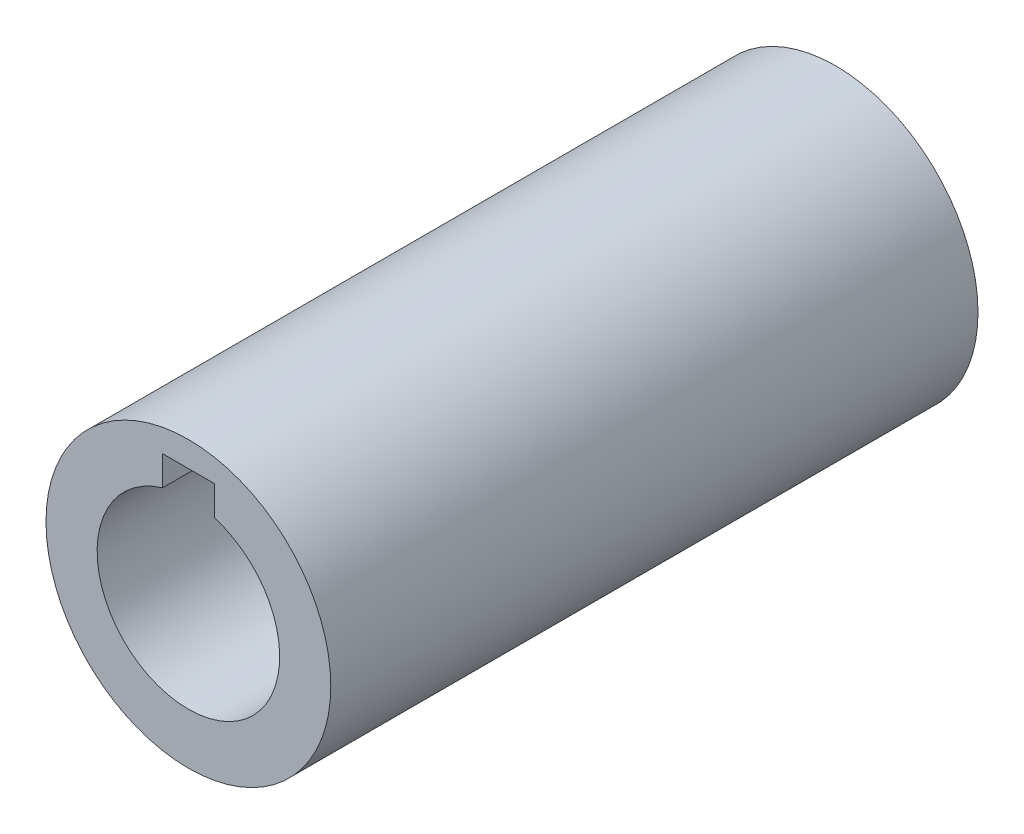
ISO-10303-21;
HEADER;
FILE_DESCRIPTION(('STEP AP214'),'2;1');
FILE_NAME('part.step','',(''),(''),'','','');
FILE_SCHEMA(('AUTOMOTIVE_DESIGN { 1 0 10303 214 1 1 1 1 }'));
ENDSEC;
DATA;
#1=APPLICATION_CONTEXT('core data for automotive mechanical design processes');
#2=APPLICATION_PROTOCOL_DEFINITION('international standard','automotive_design',2000,#1);
#3=PRODUCT_CONTEXT('',#1,'mechanical');
#4=PRODUCT('Part','Part','',(#3));
#5=PRODUCT_RELATED_PRODUCT_CATEGORY('part','',(#4));
#6=PRODUCT_DEFINITION_FORMATION('','',#4);
#7=PRODUCT_DEFINITION_CONTEXT('part definition',#1,'design');
#8=PRODUCT_DEFINITION('design','',#6,#7);
#9=PRODUCT_DEFINITION_SHAPE('','',#8);
#10=(LENGTH_UNIT() NAMED_UNIT(*) SI_UNIT(.MILLI.,.METRE.));
#11=(NAMED_UNIT(*) PLANE_ANGLE_UNIT() SI_UNIT($,.RADIAN.));
#12=(NAMED_UNIT(*) SI_UNIT($,.STERADIAN.) SOLID_ANGLE_UNIT());
#13=UNCERTAINTY_MEASURE_WITH_UNIT(LENGTH_MEASURE(1.E-05),#10,'distance_accuracy_value','');
#14=(GEOMETRIC_REPRESENTATION_CONTEXT(3) GLOBAL_UNCERTAINTY_ASSIGNED_CONTEXT((#13)) GLOBAL_UNIT_ASSIGNED_CONTEXT((#10,
#11,#12)) REPRESENTATION_CONTEXT('',''));
#15=CARTESIAN_POINT('',(0.,0.,0.));
#16=DIRECTION('',(0.,0.,1.));
#17=DIRECTION('',(1.,0.,0.));
#18=AXIS2_PLACEMENT_3D('',#15,#16,#17);
#19=CARTESIAN_POINT('',(0.,0.,100.));
#20=DIRECTION('',(0.,0.,1.));
#21=DIRECTION('',(1.,0.,0.));
#22=AXIS2_PLACEMENT_3D('',#19,#20,#21);
#23=PLANE('',#22);
#24=DIRECTION('',(0.,1.,0.));
#25=VECTOR('',#24,1.);
#26=CARTESIAN_POINT('',(-4.,12.1,100.));
#27=LINE('',#26,#25);
#28=CARTESIAN_POINT('',(-4.,13.5207248326412,100.));
#29=VERTEX_POINT('',#28);
#30=CARTESIAN_POINT('',(-4.,18.1,100.));
#31=VERTEX_POINT('',#30);
#32=EDGE_CURVE('E82',#29,#31,#27,.T.);
#33=ORIENTED_EDGE('',*,*,#32,.T.);
#34=DIRECTION('',(-1.,0.,0.));
#35=VECTOR('',#34,1.);
#36=CARTESIAN_POINT('',(0.,18.1,100.));
#37=LINE('',#36,#35);
#38=CARTESIAN_POINT('',(4.,18.1,100.));
#39=VERTEX_POINT('',#38);
#40=EDGE_CURVE('E73',#39,#31,#37,.T.);
#41=ORIENTED_EDGE('',*,*,#40,.F.);
#42=DIRECTION('',(0.,-1.,0.));
#43=VECTOR('',#42,1.);
#44=CARTESIAN_POINT('',(4.,18.1,100.));
#45=LINE('',#44,#43);
#46=CARTESIAN_POINT('',(4.,13.5207248326412,100.));
#47=VERTEX_POINT('',#46);
#48=EDGE_CURVE('E96',#39,#47,#45,.T.);
#49=ORIENTED_EDGE('',*,*,#48,.T.);
#50=CARTESIAN_POINT('',(0.,0.,100.));
#51=DIRECTION('',(0.,0.,1.));
#52=DIRECTION('',(1.,0.,0.));
#53=AXIS2_PLACEMENT_3D('',#50,#51,#52);
#54=CIRCLE('',#53,14.1);
#55=EDGE_CURVE('E95',#29,#47,#54,.T.);
#56=ORIENTED_EDGE('',*,*,#55,.F.);
#57=EDGE_LOOP('',(#33,#41,#49,#56));
#58=FACE_BOUND('',#57,.T.);
#59=CARTESIAN_POINT('',(0.,0.,100.));
#60=DIRECTION('',(0.,0.,1.));
#61=DIRECTION('',(1.,0.,0.));
#62=AXIS2_PLACEMENT_3D('',#59,#60,#61);
#63=CIRCLE('',#62,22.);
#64=CARTESIAN_POINT('',(22.,0.,100.));
#65=VERTEX_POINT('',#64);
#66=EDGE_CURVE('E108',#65,#65,#63,.T.);
#67=ORIENTED_EDGE('',*,*,#66,.T.);
#68=EDGE_LOOP('',(#67));
#69=FACE_BOUND('',#68,.T.);
#70=ADVANCED_FACE('F35',(#58,#69),#23,.T.);
#71=CARTESIAN_POINT('',(0.,0.,0.));
#72=DIRECTION('',(0.,0.,1.));
#73=DIRECTION('',(1.,0.,0.));
#74=AXIS2_PLACEMENT_3D('',#71,#72,#73);
#75=PLANE('',#74);
#76=CARTESIAN_POINT('',(0.,0.,0.));
#77=DIRECTION('',(0.,0.,1.));
#78=DIRECTION('',(1.,0.,0.));
#79=AXIS2_PLACEMENT_3D('',#76,#77,#78);
#80=CIRCLE('',#79,22.);
#81=CARTESIAN_POINT('',(22.,0.,0.));
#82=VERTEX_POINT('',#81);
#83=EDGE_CURVE('E105',#82,#82,#80,.T.);
#84=ORIENTED_EDGE('',*,*,#83,.F.);
#85=EDGE_LOOP('',(#84));
#86=FACE_BOUND('',#85,.T.);
#87=DIRECTION('',(1.,0.,0.));
#88=VECTOR('',#87,1.);
#89=CARTESIAN_POINT('',(0.,18.1,0.));
#90=LINE('',#89,#88);
#91=CARTESIAN_POINT('',(-4.,18.1,0.));
#92=VERTEX_POINT('',#91);
#93=CARTESIAN_POINT('',(4.,18.1,0.));
#94=VERTEX_POINT('',#93);
#95=EDGE_CURVE('E83',#92,#94,#90,.T.);
#96=ORIENTED_EDGE('',*,*,#95,.F.);
#97=DIRECTION('',(0.,1.,0.));
#98=VECTOR('',#97,1.);
#99=CARTESIAN_POINT('',(-4.,12.1,0.));
#100=LINE('',#99,#98);
#101=CARTESIAN_POINT('',(-4.,13.5207248326412,0.));
#102=VERTEX_POINT('',#101);
#103=EDGE_CURVE('E89',#102,#92,#100,.T.);
#104=ORIENTED_EDGE('',*,*,#103,.F.);
#105=CARTESIAN_POINT('',(0.,0.,0.));
#106=DIRECTION('',(0.,0.,1.));
#107=DIRECTION('',(1.,0.,0.));
#108=AXIS2_PLACEMENT_3D('',#105,#106,#107);
#109=CIRCLE('',#108,14.1);
#110=CARTESIAN_POINT('',(4.,13.5207248326412,0.));
#111=VERTEX_POINT('',#110);
#112=EDGE_CURVE('E90',#102,#111,#109,.T.);
#113=ORIENTED_EDGE('',*,*,#112,.T.);
#114=DIRECTION('',(0.,-1.,0.));
#115=VECTOR('',#114,1.);
#116=CARTESIAN_POINT('',(4.,18.1,0.));
#117=LINE('',#116,#115);
#118=EDGE_CURVE('E50',#94,#111,#117,.T.);
#119=ORIENTED_EDGE('',*,*,#118,.F.);
#120=EDGE_LOOP('',(#96,#104,#113,#119));
#121=FACE_BOUND('',#120,.T.);
#122=ADVANCED_FACE('F115',(#86,#121),#75,.F.);
#123=CARTESIAN_POINT('',(0.,0.,100.));
#124=DIRECTION('',(0.,0.,-1.));
#125=DIRECTION('',(-1.,0.,0.));
#126=AXIS2_PLACEMENT_3D('',#123,#124,#125);
#127=CYLINDRICAL_SURFACE('',#126,22.);
#128=ORIENTED_EDGE('',*,*,#66,.F.);
#129=EDGE_LOOP('',(#128));
#130=FACE_BOUND('',#129,.T.);
#131=ORIENTED_EDGE('',*,*,#83,.T.);
#132=EDGE_LOOP('',(#131));
#133=FACE_BOUND('',#132,.T.);
#134=ADVANCED_FACE('F37',(#130,#133),#127,.T.);
#135=CARTESIAN_POINT('',(0.,0.,100.));
#136=DIRECTION('',(0.,0.,-1.));
#137=DIRECTION('',(-1.,0.,0.));
#138=AXIS2_PLACEMENT_3D('',#135,#136,#137);
#139=CYLINDRICAL_SURFACE('',#138,14.1);
#140=DIRECTION('',(0.,0.,-1.));
#141=VECTOR('',#140,1.);
#142=CARTESIAN_POINT('',(-4.,13.5207248326412,100.));
#143=LINE('',#142,#141);
#144=EDGE_CURVE('E11',#29,#102,#143,.T.);
#145=ORIENTED_EDGE('',*,*,#144,.F.);
#146=ORIENTED_EDGE('',*,*,#55,.T.);
#147=DIRECTION('',(0.,0.,-1.));
#148=VECTOR('',#147,1.);
#149=CARTESIAN_POINT('',(4.,13.5207248326412,100.));
#150=LINE('',#149,#148);
#151=EDGE_CURVE('E43',#111,#47,#150,.F.);
#152=ORIENTED_EDGE('',*,*,#151,.F.);
#153=ORIENTED_EDGE('',*,*,#112,.F.);
#154=EDGE_LOOP('',(#145,#146,#152,#153));
#155=FACE_BOUND('',#154,.T.);
#156=ADVANCED_FACE('F120',(#155),#139,.F.);
#157=CARTESIAN_POINT('',(-4.,12.1,100.));
#158=DIRECTION('',(-1.,0.,0.));
#159=DIRECTION('',(0.,0.,1.));
#160=AXIS2_PLACEMENT_3D('',#157,#158,#159);
#161=PLANE('',#160);
#162=ORIENTED_EDGE('',*,*,#144,.T.);
#163=ORIENTED_EDGE('',*,*,#103,.T.);
#164=DIRECTION('',(0.,0.,-1.));
#165=VECTOR('',#164,1.);
#166=CARTESIAN_POINT('',(-4.,18.1,100.));
#167=LINE('',#166,#165);
#168=EDGE_CURVE('E77',#31,#92,#167,.T.);
#169=ORIENTED_EDGE('',*,*,#168,.F.);
#170=ORIENTED_EDGE('',*,*,#32,.F.);
#171=EDGE_LOOP('',(#162,#163,#169,#170));
#172=FACE_BOUND('',#171,.T.);
#173=ADVANCED_FACE('F86',(#172),#161,.F.);
#174=CARTESIAN_POINT('',(4.,18.1,100.));
#175=DIRECTION('',(1.,0.,0.));
#176=DIRECTION('',(0.,1.,0.));
#177=AXIS2_PLACEMENT_3D('',#174,#175,#176);
#178=PLANE('',#177);
#179=ORIENTED_EDGE('',*,*,#151,.T.);
#180=ORIENTED_EDGE('',*,*,#48,.F.);
#181=DIRECTION('',(0.,0.,-1.));
#182=VECTOR('',#181,1.);
#183=CARTESIAN_POINT('',(4.,18.1,100.));
#184=LINE('',#183,#182);
#185=EDGE_CURVE('E79',#39,#94,#184,.T.);
#186=ORIENTED_EDGE('',*,*,#185,.T.);
#187=ORIENTED_EDGE('',*,*,#118,.T.);
#188=EDGE_LOOP('',(#179,#180,#186,#187));
#189=FACE_BOUND('',#188,.T.);
#190=ADVANCED_FACE('F127',(#189),#178,.F.);
#191=CARTESIAN_POINT('',(0.,18.1,100.));
#192=DIRECTION('',(0.,1.,0.));
#193=DIRECTION('',(0.,0.,1.));
#194=AXIS2_PLACEMENT_3D('',#191,#192,#193);
#195=PLANE('',#194);
#196=ORIENTED_EDGE('',*,*,#95,.T.);
#197=ORIENTED_EDGE('',*,*,#185,.F.);
#198=ORIENTED_EDGE('',*,*,#40,.T.);
#199=ORIENTED_EDGE('',*,*,#168,.T.);
#200=EDGE_LOOP('',(#196,#197,#198,#199));
#201=FACE_BOUND('',#200,.T.);
#202=ADVANCED_FACE('F76',(#201),#195,.F.);
#203=CLOSED_SHELL('',(#70,#122,#134,#156,#173,#190,#202));
#204=MANIFOLD_SOLID_BREP('B2',#203);
#205=ADVANCED_BREP_SHAPE_REPRESENTATION('',(#18,#204),#14);
#206=SHAPE_DEFINITION_REPRESENTATION(#9,#205);
ENDSEC;
END-ISO-10303-21;
